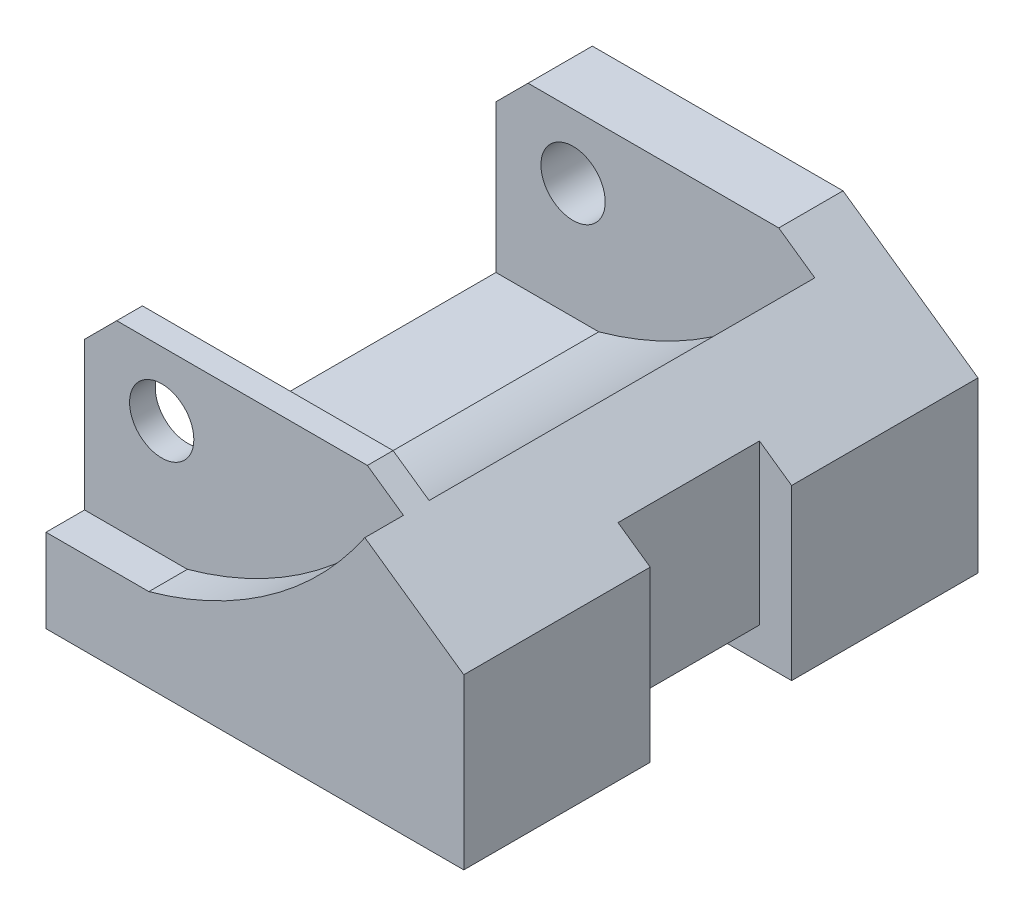
ISO-10303-21;
HEADER;
FILE_DESCRIPTION(('STEP AP214'),'2;1');
FILE_NAME('part.step','',(''),(''),'','','');
FILE_SCHEMA(('AUTOMOTIVE_DESIGN { 1 0 10303 214 1 1 1 1 }'));
ENDSEC;
DATA;
#1=APPLICATION_CONTEXT('core data for automotive mechanical design processes');
#2=APPLICATION_PROTOCOL_DEFINITION('international standard','automotive_design',2000,#1);
#3=PRODUCT_CONTEXT('',#1,'mechanical');
#4=PRODUCT('Part','Part','',(#3));
#5=PRODUCT_RELATED_PRODUCT_CATEGORY('part','',(#4));
#6=PRODUCT_DEFINITION_FORMATION('','',#4);
#7=PRODUCT_DEFINITION_CONTEXT('part definition',#1,'design');
#8=PRODUCT_DEFINITION('design','',#6,#7);
#9=PRODUCT_DEFINITION_SHAPE('','',#8);
#10=(LENGTH_UNIT() NAMED_UNIT(*) SI_UNIT(.MILLI.,.METRE.));
#11=(NAMED_UNIT(*) PLANE_ANGLE_UNIT() SI_UNIT($,.RADIAN.));
#12=(NAMED_UNIT(*) SI_UNIT($,.STERADIAN.) SOLID_ANGLE_UNIT());
#13=UNCERTAINTY_MEASURE_WITH_UNIT(LENGTH_MEASURE(1.E-05),#10,'distance_accuracy_value','');
#14=(GEOMETRIC_REPRESENTATION_CONTEXT(3) GLOBAL_UNCERTAINTY_ASSIGNED_CONTEXT((#13)) GLOBAL_UNIT_ASSIGNED_CONTEXT((#10,
#11,#12)) REPRESENTATION_CONTEXT('',''));
#15=CARTESIAN_POINT('',(0.,0.,0.));
#16=DIRECTION('',(0.,0.,1.));
#17=DIRECTION('',(1.,0.,0.));
#18=AXIS2_PLACEMENT_3D('',#15,#16,#17);
#19=CARTESIAN_POINT('',(65.,0.,40.));
#20=DIRECTION('',(-1.,0.,0.));
#21=DIRECTION('',(0.,0.,1.));
#22=AXIS2_PLACEMENT_3D('',#19,#20,#21);
#23=PLANE('',#22);
#24=DIRECTION('',(0.,0.,-1.));
#25=VECTOR('',#24,1.);
#26=CARTESIAN_POINT('',(65.,0.,40.));
#27=LINE('',#26,#25);
#28=CARTESIAN_POINT('',(65.,0.,40.));
#29=VERTEX_POINT('',#28);
#30=CARTESIAN_POINT('',(65.,0.,11.));
#31=VERTEX_POINT('',#30);
#32=EDGE_CURVE('E216',#29,#31,#27,.T.);
#33=ORIENTED_EDGE('',*,*,#32,.T.);
#34=DIRECTION('',(0.,-1.,0.));
#35=VECTOR('',#34,1.);
#36=CARTESIAN_POINT('',(65.,0.,11.));
#37=LINE('',#36,#35);
#38=CARTESIAN_POINT('',(65.,26.2956416975963,11.));
#39=VERTEX_POINT('',#38);
#40=EDGE_CURVE('E189',#39,#31,#37,.T.);
#41=ORIENTED_EDGE('',*,*,#40,.F.);
#42=DIRECTION('',(0.,0.,-1.));
#43=VECTOR('',#42,1.);
#44=CARTESIAN_POINT('',(65.,26.2956416975963,40.));
#45=LINE('',#44,#43);
#46=CARTESIAN_POINT('',(65.,26.2956416975963,40.));
#47=VERTEX_POINT('',#46);
#48=EDGE_CURVE('E360',#47,#39,#45,.T.);
#49=ORIENTED_EDGE('',*,*,#48,.F.);
#50=DIRECTION('',(0.,1.,0.));
#51=VECTOR('',#50,1.);
#52=CARTESIAN_POINT('',(65.,0.,40.));
#53=LINE('',#52,#51);
#54=EDGE_CURVE('E336',#29,#47,#53,.T.);
#55=ORIENTED_EDGE('',*,*,#54,.F.);
#56=EDGE_LOOP('',(#33,#41,#49,#55));
#57=FACE_BOUND('',#56,.T.);
#58=ADVANCED_FACE('F43',(#57),#23,.F.);
#59=CARTESIAN_POINT('',(0.,0.,40.));
#60=DIRECTION('',(0.,1.,0.));
#61=DIRECTION('',(0.,0.,1.));
#62=AXIS2_PLACEMENT_3D('',#59,#60,#61);
#63=PLANE('',#62);
#64=DIRECTION('',(1.,0.,0.));
#65=VECTOR('',#64,1.);
#66=CARTESIAN_POINT('',(0.,0.,-11.));
#67=LINE('',#66,#65);
#68=CARTESIAN_POINT('',(0.,0.,-11.));
#69=VERTEX_POINT('',#68);
#70=CARTESIAN_POINT('',(65.,0.,-11.));
#71=VERTEX_POINT('',#70);
#72=EDGE_CURVE('E191',#69,#71,#67,.T.);
#73=ORIENTED_EDGE('',*,*,#72,.F.);
#74=DIRECTION('',(0.,0.,-1.));
#75=VECTOR('',#74,1.);
#76=CARTESIAN_POINT('',(0.,0.,40.));
#77=LINE('',#76,#75);
#78=CARTESIAN_POINT('',(0.,0.,-40.));
#79=VERTEX_POINT('',#78);
#80=EDGE_CURVE('E215',#69,#79,#77,.T.);
#81=ORIENTED_EDGE('',*,*,#80,.T.);
#82=DIRECTION('',(1.,0.,0.));
#83=VECTOR('',#82,1.);
#84=CARTESIAN_POINT('',(0.,0.,-40.));
#85=LINE('',#84,#83);
#86=CARTESIAN_POINT('',(65.,0.,-40.));
#87=VERTEX_POINT('',#86);
#88=EDGE_CURVE('E344',#79,#87,#85,.T.);
#89=ORIENTED_EDGE('',*,*,#88,.T.);
#90=EDGE_CURVE('E358',#71,#87,#27,.T.);
#91=ORIENTED_EDGE('',*,*,#90,.F.);
#92=EDGE_LOOP('',(#73,#81,#89,#91));
#93=FACE_BOUND('',#92,.T.);
#94=ADVANCED_FACE('F435',(#93),#63,.F.);
#95=CARTESIAN_POINT('',(0.,41.,40.));
#96=DIRECTION('',(1.,0.,0.));
#97=DIRECTION('',(0.,1.,0.));
#98=AXIS2_PLACEMENT_3D('',#95,#96,#97);
#99=PLANE('',#98);
#100=DIRECTION('',(0.,-1.,0.));
#101=VECTOR('',#100,1.);
#102=CARTESIAN_POINT('',(0.,0.,-11.));
#103=LINE('',#102,#101);
#104=CARTESIAN_POINT('',(0.,5.,-11.));
#105=VERTEX_POINT('',#104);
#106=EDGE_CURVE('E206',#105,#69,#103,.T.);
#107=ORIENTED_EDGE('',*,*,#106,.F.);
#108=DIRECTION('',(0.,0.,-1.));
#109=VECTOR('',#108,1.);
#110=CARTESIAN_POINT('',(0.,5.,0.));
#111=LINE('',#110,#109);
#112=CARTESIAN_POINT('',(0.,5.,11.));
#113=VERTEX_POINT('',#112);
#114=EDGE_CURVE('E202',#113,#105,#111,.T.);
#115=ORIENTED_EDGE('',*,*,#114,.F.);
#116=DIRECTION('',(0.,-1.,0.));
#117=VECTOR('',#116,1.);
#118=CARTESIAN_POINT('',(0.,0.,11.));
#119=LINE('',#118,#117);
#120=CARTESIAN_POINT('',(0.,0.,11.));
#121=VERTEX_POINT('',#120);
#122=EDGE_CURVE('E56',#113,#121,#119,.T.);
#123=ORIENTED_EDGE('',*,*,#122,.T.);
#124=CARTESIAN_POINT('',(0.,0.,40.));
#125=VERTEX_POINT('',#124);
#126=EDGE_CURVE('E204',#125,#121,#77,.T.);
#127=ORIENTED_EDGE('',*,*,#126,.F.);
#128=DIRECTION('',(0.,-1.,0.));
#129=VECTOR('',#128,1.);
#130=CARTESIAN_POINT('',(0.,41.,40.));
#131=LINE('',#130,#129);
#132=CARTESIAN_POINT('',(0.,13.,40.));
#133=VERTEX_POINT('',#132);
#134=EDGE_CURVE('E335',#133,#125,#131,.T.);
#135=ORIENTED_EDGE('',*,*,#134,.F.);
#136=DIRECTION('',(0.,0.,1.));
#137=VECTOR('',#136,1.);
#138=CARTESIAN_POINT('',(0.,13.,34.));
#139=LINE('',#138,#137);
#140=CARTESIAN_POINT('',(0.,13.,34.));
#141=VERTEX_POINT('',#140);
#142=EDGE_CURVE('E272',#141,#133,#139,.T.);
#143=ORIENTED_EDGE('',*,*,#142,.F.);
#144=DIRECTION('',(0.,1.,0.));
#145=VECTOR('',#144,1.);
#146=CARTESIAN_POINT('',(0.,0.,34.));
#147=LINE('',#146,#145);
#148=CARTESIAN_POINT('',(0.,36.,34.));
#149=VERTEX_POINT('',#148);
#150=EDGE_CURVE('E262',#141,#149,#147,.T.);
#151=ORIENTED_EDGE('',*,*,#150,.T.);
#152=DIRECTION('',(0.,0.,-1.));
#153=VECTOR('',#152,1.);
#154=CARTESIAN_POINT('',(0.,36.,40.));
#155=LINE('',#154,#153);
#156=CARTESIAN_POINT('',(0.,36.,30.));
#157=VERTEX_POINT('',#156);
#158=EDGE_CURVE('E212',#149,#157,#155,.T.);
#159=ORIENTED_EDGE('',*,*,#158,.T.);
#160=DIRECTION('',(0.,-1.,0.));
#161=VECTOR('',#160,1.);
#162=CARTESIAN_POINT('',(0.,36.,30.));
#163=LINE('',#162,#161);
#164=CARTESIAN_POINT('',(0.,13.,30.));
#165=VERTEX_POINT('',#164);
#166=EDGE_CURVE('E290',#157,#165,#163,.T.);
#167=ORIENTED_EDGE('',*,*,#166,.T.);
#168=DIRECTION('',(0.,0.,1.));
#169=VECTOR('',#168,1.);
#170=CARTESIAN_POINT('',(0.,13.,-30.));
#171=LINE('',#170,#169);
#172=CARTESIAN_POINT('',(0.,13.,-30.));
#173=VERTEX_POINT('',#172);
#174=EDGE_CURVE('E308',#173,#165,#171,.T.);
#175=ORIENTED_EDGE('',*,*,#174,.F.);
#176=DIRECTION('',(0.,-1.,0.));
#177=VECTOR('',#176,1.);
#178=CARTESIAN_POINT('',(0.,36.,-30.));
#179=LINE('',#178,#177);
#180=CARTESIAN_POINT('',(0.,36.,-30.));
#181=VERTEX_POINT('',#180);
#182=EDGE_CURVE('E286',#181,#173,#179,.T.);
#183=ORIENTED_EDGE('',*,*,#182,.F.);
#184=CARTESIAN_POINT('',(0.,36.,-40.));
#185=VERTEX_POINT('',#184);
#186=EDGE_CURVE('E211',#181,#185,#155,.T.);
#187=ORIENTED_EDGE('',*,*,#186,.T.);
#188=DIRECTION('',(0.,-1.,0.));
#189=VECTOR('',#188,1.);
#190=CARTESIAN_POINT('',(0.,41.,-40.));
#191=LINE('',#190,#189);
#192=EDGE_CURVE('E332',#185,#79,#191,.T.);
#193=ORIENTED_EDGE('',*,*,#192,.T.);
#194=ORIENTED_EDGE('',*,*,#80,.F.);
#195=EDGE_LOOP('',(#107,#115,#123,#127,#135,#143,#151,#159,#167,#175,#183,#187,#193,#194));
#196=FACE_BOUND('',#195,.T.);
#197=ADVANCED_FACE('F205',(#196),#99,.F.);
#198=DIRECTION('',(0.,-1.,0.));
#199=VECTOR('',#198,1.);
#200=CARTESIAN_POINT('',(65.,0.,-11.));
#201=LINE('',#200,#199);
#202=CARTESIAN_POINT('',(65.,26.2956416975963,-11.));
#203=VERTEX_POINT('',#202);
#204=EDGE_CURVE('E233',#203,#71,#201,.T.);
#205=ORIENTED_EDGE('',*,*,#204,.T.);
#206=ORIENTED_EDGE('',*,*,#90,.T.);
#207=DIRECTION('',(0.,1.,0.));
#208=VECTOR('',#207,1.);
#209=CARTESIAN_POINT('',(65.,0.,-40.));
#210=LINE('',#209,#208);
#211=CARTESIAN_POINT('',(65.,26.2956416975963,-40.));
#212=VERTEX_POINT('',#211);
#213=EDGE_CURVE('E350',#87,#212,#210,.T.);
#214=ORIENTED_EDGE('',*,*,#213,.T.);
#215=EDGE_CURVE('E357',#203,#212,#45,.T.);
#216=ORIENTED_EDGE('',*,*,#215,.F.);
#217=EDGE_LOOP('',(#205,#206,#214,#216));
#218=FACE_BOUND('',#217,.T.);
#219=ADVANCED_FACE('F368',(#218),#23,.F.);
#220=CARTESIAN_POINT('',(0.,36.,40.));
#221=DIRECTION('',(0.707106781186546,-0.707106781186548,0.));
#222=DIRECTION('',(0.,0.,-1.));
#223=AXIS2_PLACEMENT_3D('',#220,#221,#222);
#224=PLANE('',#223);
#225=ORIENTED_EDGE('',*,*,#158,.F.);
#226=DIRECTION('',(0.707106781186549,0.707106781186547,0.));
#227=VECTOR('',#226,1.);
#228=CARTESIAN_POINT('',(-18.,18.,34.));
#229=LINE('',#228,#227);
#230=CARTESIAN_POINT('',(5.00000000000003,41.,34.));
#231=VERTEX_POINT('',#230);
#232=EDGE_CURVE('E270',#149,#231,#229,.T.);
#233=ORIENTED_EDGE('',*,*,#232,.T.);
#234=DIRECTION('',(0.,0.,1.));
#235=VECTOR('',#234,1.);
#236=CARTESIAN_POINT('',(5.00000000000003,41.,40.));
#237=LINE('',#236,#235);
#238=CARTESIAN_POINT('',(5.00000000000003,41.,30.));
#239=VERTEX_POINT('',#238);
#240=EDGE_CURVE('E225',#239,#231,#237,.T.);
#241=ORIENTED_EDGE('',*,*,#240,.F.);
#242=DIRECTION('',(-0.707106781186548,-0.707106781186546,0.));
#243=VECTOR('',#242,1.);
#244=CARTESIAN_POINT('',(5.00000000000003,41.,30.));
#245=LINE('',#244,#243);
#246=EDGE_CURVE('E294',#239,#157,#245,.T.);
#247=ORIENTED_EDGE('',*,*,#246,.T.);
#248=EDGE_LOOP('',(#225,#233,#241,#247));
#249=FACE_BOUND('',#248,.T.);
#250=ADVANCED_FACE('F403',(#249),#224,.F.);
#251=CARTESIAN_POINT('',(0.,0.,40.));
#252=DIRECTION('',(0.,0.,1.));
#253=DIRECTION('',(1.,0.,0.));
#254=AXIS2_PLACEMENT_3D('',#251,#252,#253);
#255=PLANE('',#254);
#256=CARTESIAN_POINT('',(0.,70.8273291792038,40.));
#257=DIRECTION('',(0.,0.,1.));
#258=DIRECTION('',(1.,0.,0.));
#259=AXIS2_PLACEMENT_3D('',#256,#257,#258);
#260=CIRCLE('',#259,60.);
#261=CARTESIAN_POINT('',(16.,13.,40.));
#262=VERTEX_POINT('',#261);
#263=CARTESIAN_POINT('',(49.6060034384075,37.0746341331975,40.));
#264=VERTEX_POINT('',#263);
#265=EDGE_CURVE('E255',#262,#264,#260,.T.);
#266=ORIENTED_EDGE('',*,*,#265,.F.);
#267=DIRECTION('',(-1.,0.,0.));
#268=VECTOR('',#267,1.);
#269=CARTESIAN_POINT('',(0.,13.,40.));
#270=LINE('',#269,#268);
#271=EDGE_CURVE('E259',#262,#133,#270,.T.);
#272=ORIENTED_EDGE('',*,*,#271,.T.);
#273=ORIENTED_EDGE('',*,*,#134,.T.);
#274=DIRECTION('',(1.,0.,0.));
#275=VECTOR('',#274,1.);
#276=CARTESIAN_POINT('',(0.,0.,40.));
#277=LINE('',#276,#275);
#278=EDGE_CURVE('E209',#125,#29,#277,.T.);
#279=ORIENTED_EDGE('',*,*,#278,.T.);
#280=ORIENTED_EDGE('',*,*,#54,.T.);
#281=DIRECTION('',(-0.819152044288995,0.573576436351041,0.));
#282=VECTOR('',#281,1.);
#283=CARTESIAN_POINT('',(65.,26.2956416975963,40.));
#284=LINE('',#283,#282);
#285=EDGE_CURVE('E337',#47,#264,#284,.T.);
#286=ORIENTED_EDGE('',*,*,#285,.T.);
#287=EDGE_LOOP('',(#266,#272,#273,#279,#280,#286));
#288=FACE_BOUND('',#287,.T.);
#289=ADVANCED_FACE('F418',(#288),#255,.T.);
#290=CARTESIAN_POINT('',(12.,31.,40.));
#291=DIRECTION('',(0.,0.,-1.));
#292=DIRECTION('',(-1.,0.,0.));
#293=AXIS2_PLACEMENT_3D('',#290,#291,#292);
#294=CYLINDRICAL_SURFACE('',#293,5.);
#295=CARTESIAN_POINT('',(12.,31.,30.));
#296=DIRECTION('',(0.,0.,1.));
#297=DIRECTION('',(1.,0.,0.));
#298=AXIS2_PLACEMENT_3D('',#295,#296,#297);
#299=CIRCLE('',#298,5.);
#300=CARTESIAN_POINT('',(17.,31.,30.));
#301=VERTEX_POINT('',#300);
#302=EDGE_CURVE('E282',#301,#301,#299,.T.);
#303=ORIENTED_EDGE('',*,*,#302,.F.);
#304=EDGE_LOOP('',(#303));
#305=FACE_BOUND('',#304,.T.);
#306=CARTESIAN_POINT('',(12.,31.,34.));
#307=DIRECTION('',(0.,0.,1.));
#308=DIRECTION('',(1.,0.,0.));
#309=AXIS2_PLACEMENT_3D('',#306,#307,#308);
#310=CIRCLE('',#309,5.);
#311=CARTESIAN_POINT('',(17.,31.,34.));
#312=VERTEX_POINT('',#311);
#313=EDGE_CURVE('E249',#312,#312,#310,.T.);
#314=ORIENTED_EDGE('',*,*,#313,.T.);
#315=EDGE_LOOP('',(#314));
#316=FACE_BOUND('',#315,.T.);
#317=ADVANCED_FACE('F465',(#305,#316),#294,.F.);
#318=CARTESIAN_POINT('',(44.,41.,40.));
#319=DIRECTION('',(0.,-1.,0.));
#320=DIRECTION('',(1.,0.,0.));
#321=AXIS2_PLACEMENT_3D('',#318,#319,#320);
#322=PLANE('',#321);
#323=DIRECTION('',(-1.,0.,0.));
#324=VECTOR('',#323,1.);
#325=CARTESIAN_POINT('',(44.,41.,-30.));
#326=LINE('',#325,#324);
#327=CARTESIAN_POINT('',(44.,41.,-30.));
#328=VERTEX_POINT('',#327);
#329=CARTESIAN_POINT('',(5.00000000000003,41.,-30.));
#330=VERTEX_POINT('',#329);
#331=EDGE_CURVE('E305',#328,#330,#326,.T.);
#332=ORIENTED_EDGE('',*,*,#331,.F.);
#333=DIRECTION('',(0.,0.,-1.));
#334=VECTOR('',#333,1.);
#335=CARTESIAN_POINT('',(44.,41.,40.));
#336=LINE('',#335,#334);
#337=CARTESIAN_POINT('',(44.,41.,-40.));
#338=VERTEX_POINT('',#337);
#339=EDGE_CURVE('E342',#328,#338,#336,.T.);
#340=ORIENTED_EDGE('',*,*,#339,.T.);
#341=DIRECTION('',(-1.,0.,0.));
#342=VECTOR('',#341,1.);
#343=CARTESIAN_POINT('',(44.,41.,-40.));
#344=LINE('',#343,#342);
#345=CARTESIAN_POINT('',(5.00000000000003,41.,-40.));
#346=VERTEX_POINT('',#345);
#347=EDGE_CURVE('E331',#338,#346,#344,.T.);
#348=ORIENTED_EDGE('',*,*,#347,.T.);
#349=EDGE_CURVE('E224',#346,#330,#237,.T.);
#350=ORIENTED_EDGE('',*,*,#349,.T.);
#351=EDGE_LOOP('',(#332,#340,#348,#350));
#352=FACE_BOUND('',#351,.T.);
#353=ADVANCED_FACE('F380',(#352),#322,.F.);
#354=CARTESIAN_POINT('',(12.,31.,-40.));
#355=DIRECTION('',(0.,0.,1.));
#356=DIRECTION('',(1.,0.,0.));
#357=AXIS2_PLACEMENT_3D('',#354,#355,#356);
#358=CIRCLE('',#357,5.);
#359=CARTESIAN_POINT('',(17.,31.,-40.));
#360=VERTEX_POINT('',#359);
#361=EDGE_CURVE('E324',#360,#360,#358,.T.);
#362=ORIENTED_EDGE('',*,*,#361,.F.);
#363=EDGE_LOOP('',(#362));
#364=FACE_BOUND('',#363,.T.);
#365=CARTESIAN_POINT('',(12.,31.,-30.));
#366=DIRECTION('',(0.,0.,1.));
#367=DIRECTION('',(1.,0.,0.));
#368=AXIS2_PLACEMENT_3D('',#365,#366,#367);
#369=CIRCLE('',#368,5.);
#370=CARTESIAN_POINT('',(17.,31.,-30.));
#371=VERTEX_POINT('',#370);
#372=EDGE_CURVE('E283',#371,#371,#369,.T.);
#373=ORIENTED_EDGE('',*,*,#372,.T.);
#374=EDGE_LOOP('',(#373));
#375=FACE_BOUND('',#374,.T.);
#376=ADVANCED_FACE('F454',(#364,#375),#294,.F.);
#377=CARTESIAN_POINT('',(0.,0.,-40.));
#378=DIRECTION('',(0.,0.,1.));
#379=DIRECTION('',(1.,0.,0.));
#380=AXIS2_PLACEMENT_3D('',#377,#378,#379);
#381=PLANE('',#380);
#382=ORIENTED_EDGE('',*,*,#192,.F.);
#383=DIRECTION('',(-0.707106781186549,-0.707106781186547,0.));
#384=VECTOR('',#383,1.);
#385=CARTESIAN_POINT('',(0.,36.,-40.));
#386=LINE('',#385,#384);
#387=EDGE_CURVE('E219',#185,#346,#386,.F.);
#388=ORIENTED_EDGE('',*,*,#387,.T.);
#389=ORIENTED_EDGE('',*,*,#347,.F.);
#390=DIRECTION('',(-0.819152044288995,0.573576436351041,0.));
#391=VECTOR('',#390,1.);
#392=CARTESIAN_POINT('',(65.,26.2956416975963,-40.));
#393=LINE('',#392,#391);
#394=EDGE_CURVE('E348',#212,#338,#393,.T.);
#395=ORIENTED_EDGE('',*,*,#394,.F.);
#396=ORIENTED_EDGE('',*,*,#213,.F.);
#397=ORIENTED_EDGE('',*,*,#88,.F.);
#398=EDGE_LOOP('',(#382,#388,#389,#395,#396,#397));
#399=FACE_BOUND('',#398,.T.);
#400=ORIENTED_EDGE('',*,*,#361,.T.);
#401=EDGE_LOOP('',(#400));
#402=FACE_BOUND('',#401,.T.);
#403=ADVANCED_FACE('F371',(#399,#402),#381,.F.);
#404=ORIENTED_EDGE('',*,*,#126,.T.);
#405=DIRECTION('',(1.,0.,0.));
#406=VECTOR('',#405,1.);
#407=CARTESIAN_POINT('',(0.,0.,11.));
#408=LINE('',#407,#406);
#409=EDGE_CURVE('E190',#121,#31,#408,.T.);
#410=ORIENTED_EDGE('',*,*,#409,.T.);
#411=ORIENTED_EDGE('',*,*,#32,.F.);
#412=ORIENTED_EDGE('',*,*,#278,.F.);
#413=EDGE_LOOP('',(#404,#410,#411,#412));
#414=FACE_BOUND('',#413,.T.);
#415=ADVANCED_FACE('F207',(#414),#63,.F.);
#416=CARTESIAN_POINT('',(65.,26.2956416975963,40.));
#417=DIRECTION('',(-0.573576436351041,-0.819152044288995,0.));
#418=DIRECTION('',(0.819152044288995,-0.573576436351041,0.));
#419=AXIS2_PLACEMENT_3D('',#416,#417,#418);
#420=PLANE('',#419);
#421=ORIENTED_EDGE('',*,*,#48,.T.);
#422=DIRECTION('',(-0.819152044288995,0.573576436351041,0.));
#423=VECTOR('',#422,1.);
#424=CARTESIAN_POINT('',(65.,26.2956416975963,11.));
#425=LINE('',#424,#423);
#426=CARTESIAN_POINT('',(60.,29.7966793886448,11.));
#427=VERTEX_POINT('',#426);
#428=EDGE_CURVE('E11',#39,#427,#425,.T.);
#429=ORIENTED_EDGE('',*,*,#428,.T.);
#430=DIRECTION('',(0.,0.,1.));
#431=VECTOR('',#430,1.);
#432=CARTESIAN_POINT('',(60.,29.7966793886448,40.));
#433=LINE('',#432,#431);
#434=CARTESIAN_POINT('',(60.,29.7966793886448,-11.));
#435=VERTEX_POINT('',#434);
#436=EDGE_CURVE('E226',#435,#427,#433,.T.);
#437=ORIENTED_EDGE('',*,*,#436,.F.);
#438=DIRECTION('',(-0.819152044288995,0.573576436351041,0.));
#439=VECTOR('',#438,1.);
#440=CARTESIAN_POINT('',(65.,26.2956416975963,-11.));
#441=LINE('',#440,#439);
#442=EDGE_CURVE('E55',#203,#435,#441,.T.);
#443=ORIENTED_EDGE('',*,*,#442,.F.);
#444=ORIENTED_EDGE('',*,*,#215,.T.);
#445=ORIENTED_EDGE('',*,*,#394,.T.);
#446=ORIENTED_EDGE('',*,*,#339,.F.);
#447=DIRECTION('',(-0.819152044288996,0.573576436351041,0.));
#448=VECTOR('',#447,1.);
#449=CARTESIAN_POINT('',(49.6060034384076,37.0746341331975,-30.));
#450=LINE('',#449,#448);
#451=CARTESIAN_POINT('',(49.6060034384075,37.0746341331975,-30.));
#452=VERTEX_POINT('',#451);
#453=EDGE_CURVE('E299',#452,#328,#450,.T.);
#454=ORIENTED_EDGE('',*,*,#453,.F.);
#455=DIRECTION('',(0.,0.,1.));
#456=VECTOR('',#455,1.);
#457=CARTESIAN_POINT('',(49.6060034384075,37.0746341331975,-30.));
#458=LINE('',#457,#456);
#459=CARTESIAN_POINT('',(49.6060034384076,37.0746341331975,30.));
#460=VERTEX_POINT('',#459);
#461=EDGE_CURVE('E325',#452,#460,#458,.T.);
#462=ORIENTED_EDGE('',*,*,#461,.T.);
#463=DIRECTION('',(-0.819152044288996,0.573576436351041,0.));
#464=VECTOR('',#463,1.);
#465=CARTESIAN_POINT('',(49.6060034384076,37.0746341331975,30.));
#466=LINE('',#465,#464);
#467=CARTESIAN_POINT('',(44.,41.,30.));
#468=VERTEX_POINT('',#467);
#469=EDGE_CURVE('E314',#460,#468,#466,.T.);
#470=ORIENTED_EDGE('',*,*,#469,.T.);
#471=CARTESIAN_POINT('',(44.,41.,34.));
#472=VERTEX_POINT('',#471);
#473=EDGE_CURVE('E354',#472,#468,#336,.T.);
#474=ORIENTED_EDGE('',*,*,#473,.F.);
#475=DIRECTION('',(0.819152044288996,-0.573576436351041,0.));
#476=VECTOR('',#475,1.);
#477=CARTESIAN_POINT('',(33.739255572946,48.1846505954664,34.));
#478=LINE('',#477,#476);
#479=CARTESIAN_POINT('',(49.6060034384075,37.0746341331975,34.));
#480=VERTEX_POINT('',#479);
#481=EDGE_CURVE('E254',#472,#480,#478,.T.);
#482=ORIENTED_EDGE('',*,*,#481,.T.);
#483=DIRECTION('',(0.,0.,1.));
#484=VECTOR('',#483,1.);
#485=CARTESIAN_POINT('',(49.6060034384075,37.0746341331975,34.));
#486=LINE('',#485,#484);
#487=EDGE_CURVE('E278',#480,#264,#486,.T.);
#488=ORIENTED_EDGE('',*,*,#487,.T.);
#489=ORIENTED_EDGE('',*,*,#285,.F.);
#490=EDGE_LOOP('',(#421,#429,#437,#443,#444,#445,#446,#454,#462,#470,#474,#482,#488,#489));
#491=FACE_BOUND('',#490,.T.);
#492=ADVANCED_FACE('F240',(#491),#420,.F.);
#493=ORIENTED_EDGE('',*,*,#240,.T.);
#494=DIRECTION('',(1.,0.,0.));
#495=VECTOR('',#494,1.);
#496=CARTESIAN_POINT('',(0.,41.,34.));
#497=LINE('',#496,#495);
#498=EDGE_CURVE('E269',#231,#472,#497,.T.);
#499=ORIENTED_EDGE('',*,*,#498,.T.);
#500=ORIENTED_EDGE('',*,*,#473,.T.);
#501=DIRECTION('',(-1.,0.,0.));
#502=VECTOR('',#501,1.);
#503=CARTESIAN_POINT('',(44.,41.,30.));
#504=LINE('',#503,#502);
#505=EDGE_CURVE('E320',#468,#239,#504,.T.);
#506=ORIENTED_EDGE('',*,*,#505,.T.);
#507=EDGE_LOOP('',(#493,#499,#500,#506));
#508=FACE_BOUND('',#507,.T.);
#509=ADVANCED_FACE('F402',(#508),#322,.F.);
#510=DIRECTION('',(-0.707106781186548,-0.707106781186546,0.));
#511=VECTOR('',#510,1.);
#512=CARTESIAN_POINT('',(5.00000000000003,41.,-30.));
#513=LINE('',#512,#511);
#514=EDGE_CURVE('E304',#330,#181,#513,.T.);
#515=ORIENTED_EDGE('',*,*,#514,.F.);
#516=ORIENTED_EDGE('',*,*,#349,.F.);
#517=ORIENTED_EDGE('',*,*,#387,.F.);
#518=ORIENTED_EDGE('',*,*,#186,.F.);
#519=EDGE_LOOP('',(#515,#516,#517,#518));
#520=FACE_BOUND('',#519,.T.);
#521=ADVANCED_FACE('F46',(#520),#224,.F.);
#522=CARTESIAN_POINT('',(0.,70.8273291792038,-30.));
#523=DIRECTION('',(0.,0.,1.));
#524=DIRECTION('',(1.,0.,0.));
#525=AXIS2_PLACEMENT_3D('',#522,#523,#524);
#526=CYLINDRICAL_SURFACE('',#525,60.);
#527=CARTESIAN_POINT('',(0.,70.8273291792038,30.));
#528=DIRECTION('',(0.,0.,1.));
#529=DIRECTION('',(1.,0.,0.));
#530=AXIS2_PLACEMENT_3D('',#527,#528,#529);
#531=CIRCLE('',#530,60.);
#532=CARTESIAN_POINT('',(16.,13.,30.));
#533=VERTEX_POINT('',#532);
#534=EDGE_CURVE('E315',#533,#460,#531,.T.);
#535=ORIENTED_EDGE('',*,*,#534,.T.);
#536=ORIENTED_EDGE('',*,*,#461,.F.);
#537=CARTESIAN_POINT('',(0.,70.8273291792038,-30.));
#538=DIRECTION('',(0.,0.,1.));
#539=DIRECTION('',(1.,0.,0.));
#540=AXIS2_PLACEMENT_3D('',#537,#538,#539);
#541=CIRCLE('',#540,60.);
#542=CARTESIAN_POINT('',(16.,13.,-30.));
#543=VERTEX_POINT('',#542);
#544=EDGE_CURVE('E300',#543,#452,#541,.T.);
#545=ORIENTED_EDGE('',*,*,#544,.F.);
#546=DIRECTION('',(0.,0.,1.));
#547=VECTOR('',#546,1.);
#548=CARTESIAN_POINT('',(16.,13.,-30.));
#549=LINE('',#548,#547);
#550=EDGE_CURVE('E326',#543,#533,#549,.T.);
#551=ORIENTED_EDGE('',*,*,#550,.T.);
#552=EDGE_LOOP('',(#535,#536,#545,#551));
#553=FACE_BOUND('',#552,.T.);
#554=ADVANCED_FACE('F394',(#553),#526,.F.);
#555=CARTESIAN_POINT('',(0.,13.,-30.));
#556=DIRECTION('',(0.,-1.,0.));
#557=DIRECTION('',(0.,0.,-1.));
#558=AXIS2_PLACEMENT_3D('',#555,#556,#557);
#559=PLANE('',#558);
#560=DIRECTION('',(1.,0.,0.));
#561=VECTOR('',#560,1.);
#562=CARTESIAN_POINT('',(0.,13.,30.));
#563=LINE('',#562,#561);
#564=EDGE_CURVE('E310',#165,#533,#563,.T.);
#565=ORIENTED_EDGE('',*,*,#564,.T.);
#566=ORIENTED_EDGE('',*,*,#550,.F.);
#567=DIRECTION('',(1.,0.,0.));
#568=VECTOR('',#567,1.);
#569=CARTESIAN_POINT('',(0.,13.,-30.));
#570=LINE('',#569,#568);
#571=EDGE_CURVE('E291',#173,#543,#570,.T.);
#572=ORIENTED_EDGE('',*,*,#571,.F.);
#573=ORIENTED_EDGE('',*,*,#174,.T.);
#574=EDGE_LOOP('',(#565,#566,#572,#573));
#575=FACE_BOUND('',#574,.T.);
#576=ADVANCED_FACE('F389',(#575),#559,.F.);
#577=CARTESIAN_POINT('',(0.,70.8273291792038,-30.));
#578=DIRECTION('',(0.,0.,1.));
#579=DIRECTION('',(1.,0.,0.));
#580=AXIS2_PLACEMENT_3D('',#577,#578,#579);
#581=PLANE('',#580);
#582=ORIENTED_EDGE('',*,*,#372,.F.);
#583=EDGE_LOOP('',(#582));
#584=FACE_BOUND('',#583,.T.);
#585=ORIENTED_EDGE('',*,*,#182,.T.);
#586=ORIENTED_EDGE('',*,*,#571,.T.);
#587=ORIENTED_EDGE('',*,*,#544,.T.);
#588=ORIENTED_EDGE('',*,*,#453,.T.);
#589=ORIENTED_EDGE('',*,*,#331,.T.);
#590=ORIENTED_EDGE('',*,*,#514,.T.);
#591=EDGE_LOOP('',(#585,#586,#587,#588,#589,#590));
#592=FACE_BOUND('',#591,.T.);
#593=ADVANCED_FACE('F382',(#584,#592),#581,.T.);
#594=CARTESIAN_POINT('',(0.,70.8273291792038,30.));
#595=DIRECTION('',(0.,0.,1.));
#596=DIRECTION('',(1.,0.,0.));
#597=AXIS2_PLACEMENT_3D('',#594,#595,#596);
#598=PLANE('',#597);
#599=ORIENTED_EDGE('',*,*,#302,.T.);
#600=EDGE_LOOP('',(#599));
#601=FACE_BOUND('',#600,.T.);
#602=ORIENTED_EDGE('',*,*,#166,.F.);
#603=ORIENTED_EDGE('',*,*,#246,.F.);
#604=ORIENTED_EDGE('',*,*,#505,.F.);
#605=ORIENTED_EDGE('',*,*,#469,.F.);
#606=ORIENTED_EDGE('',*,*,#534,.F.);
#607=ORIENTED_EDGE('',*,*,#564,.F.);
#608=EDGE_LOOP('',(#602,#603,#604,#605,#606,#607));
#609=FACE_BOUND('',#608,.T.);
#610=ADVANCED_FACE('F391',(#601,#609),#598,.F.);
#611=CARTESIAN_POINT('',(0.,70.8273291792038,34.));
#612=DIRECTION('',(0.,0.,1.));
#613=DIRECTION('',(1.,0.,0.));
#614=AXIS2_PLACEMENT_3D('',#611,#612,#613);
#615=CYLINDRICAL_SURFACE('',#614,60.);
#616=ORIENTED_EDGE('',*,*,#265,.T.);
#617=ORIENTED_EDGE('',*,*,#487,.F.);
#618=CARTESIAN_POINT('',(0.,70.8273291792038,34.));
#619=DIRECTION('',(0.,0.,1.));
#620=DIRECTION('',(1.,0.,0.));
#621=AXIS2_PLACEMENT_3D('',#618,#619,#620);
#622=CIRCLE('',#621,60.);
#623=CARTESIAN_POINT('',(16.,13.,34.));
#624=VERTEX_POINT('',#623);
#625=EDGE_CURVE('E256',#624,#480,#622,.T.);
#626=ORIENTED_EDGE('',*,*,#625,.F.);
#627=DIRECTION('',(0.,0.,1.));
#628=VECTOR('',#627,1.);
#629=CARTESIAN_POINT('',(16.,13.,34.));
#630=LINE('',#629,#628);
#631=EDGE_CURVE('E279',#624,#262,#630,.T.);
#632=ORIENTED_EDGE('',*,*,#631,.T.);
#633=EDGE_LOOP('',(#616,#617,#626,#632));
#634=FACE_BOUND('',#633,.T.);
#635=ADVANCED_FACE('F416',(#634),#615,.F.);
#636=CARTESIAN_POINT('',(0.,13.,34.));
#637=DIRECTION('',(0.,1.,0.));
#638=DIRECTION('',(0.,0.,1.));
#639=AXIS2_PLACEMENT_3D('',#636,#637,#638);
#640=PLANE('',#639);
#641=ORIENTED_EDGE('',*,*,#271,.F.);
#642=ORIENTED_EDGE('',*,*,#631,.F.);
#643=DIRECTION('',(-1.,0.,0.));
#644=VECTOR('',#643,1.);
#645=CARTESIAN_POINT('',(0.,13.,34.));
#646=LINE('',#645,#644);
#647=EDGE_CURVE('E265',#624,#141,#646,.T.);
#648=ORIENTED_EDGE('',*,*,#647,.T.);
#649=ORIENTED_EDGE('',*,*,#142,.T.);
#650=EDGE_LOOP('',(#641,#642,#648,#649));
#651=FACE_BOUND('',#650,.T.);
#652=ADVANCED_FACE('F413',(#651),#640,.T.);
#653=CARTESIAN_POINT('',(0.,70.8273291792038,34.));
#654=DIRECTION('',(0.,0.,1.));
#655=DIRECTION('',(1.,0.,0.));
#656=AXIS2_PLACEMENT_3D('',#653,#654,#655);
#657=PLANE('',#656);
#658=ORIENTED_EDGE('',*,*,#313,.F.);
#659=EDGE_LOOP('',(#658));
#660=FACE_BOUND('',#659,.T.);
#661=ORIENTED_EDGE('',*,*,#481,.F.);
#662=ORIENTED_EDGE('',*,*,#498,.F.);
#663=ORIENTED_EDGE('',*,*,#232,.F.);
#664=ORIENTED_EDGE('',*,*,#150,.F.);
#665=ORIENTED_EDGE('',*,*,#647,.F.);
#666=ORIENTED_EDGE('',*,*,#625,.T.);
#667=EDGE_LOOP('',(#661,#662,#663,#664,#665,#666));
#668=FACE_BOUND('',#667,.T.);
#669=ADVANCED_FACE('F407',(#660,#668),#657,.T.);
#670=CARTESIAN_POINT('',(60.,0.,11.));
#671=DIRECTION('',(0.,0.,1.));
#672=DIRECTION('',(1.,0.,0.));
#673=AXIS2_PLACEMENT_3D('',#670,#671,#672);
#674=PLANE('',#673);
#675=ORIENTED_EDGE('',*,*,#40,.T.);
#676=ORIENTED_EDGE('',*,*,#409,.F.);
#677=ORIENTED_EDGE('',*,*,#122,.F.);
#678=DIRECTION('',(1.,0.,0.));
#679=VECTOR('',#678,1.);
#680=CARTESIAN_POINT('',(0.,5.,11.));
#681=LINE('',#680,#679);
#682=CARTESIAN_POINT('',(60.,5.,11.));
#683=VERTEX_POINT('',#682);
#684=EDGE_CURVE('E198',#113,#683,#681,.T.);
#685=ORIENTED_EDGE('',*,*,#684,.T.);
#686=DIRECTION('',(0.,-1.,0.));
#687=VECTOR('',#686,1.);
#688=CARTESIAN_POINT('',(60.,0.,11.));
#689=LINE('',#688,#687);
#690=EDGE_CURVE('E241',#427,#683,#689,.T.);
#691=ORIENTED_EDGE('',*,*,#690,.F.);
#692=ORIENTED_EDGE('',*,*,#428,.F.);
#693=EDGE_LOOP('',(#675,#676,#677,#685,#691,#692));
#694=FACE_BOUND('',#693,.T.);
#695=ADVANCED_FACE('F187',(#694),#674,.F.);
#696=CARTESIAN_POINT('',(60.,0.,-11.));
#697=DIRECTION('',(0.,0.,1.));
#698=DIRECTION('',(0.,-1.,0.));
#699=AXIS2_PLACEMENT_3D('',#696,#697,#698);
#700=PLANE('',#699);
#701=ORIENTED_EDGE('',*,*,#442,.T.);
#702=DIRECTION('',(0.,-1.,0.));
#703=VECTOR('',#702,1.);
#704=CARTESIAN_POINT('',(60.,0.,-11.));
#705=LINE('',#704,#703);
#706=CARTESIAN_POINT('',(60.,5.,-11.));
#707=VERTEX_POINT('',#706);
#708=EDGE_CURVE('E70',#435,#707,#705,.T.);
#709=ORIENTED_EDGE('',*,*,#708,.T.);
#710=DIRECTION('',(1.,0.,0.));
#711=VECTOR('',#710,1.);
#712=CARTESIAN_POINT('',(0.,5.,-11.));
#713=LINE('',#712,#711);
#714=EDGE_CURVE('E246',#105,#707,#713,.T.);
#715=ORIENTED_EDGE('',*,*,#714,.F.);
#716=ORIENTED_EDGE('',*,*,#106,.T.);
#717=ORIENTED_EDGE('',*,*,#72,.T.);
#718=ORIENTED_EDGE('',*,*,#204,.F.);
#719=EDGE_LOOP('',(#701,#709,#715,#716,#717,#718));
#720=FACE_BOUND('',#719,.T.);
#721=ADVANCED_FACE('F229',(#720),#700,.T.);
#722=CARTESIAN_POINT('',(60.,0.,0.));
#723=DIRECTION('',(1.,0.,0.));
#724=DIRECTION('',(0.,0.,-1.));
#725=AXIS2_PLACEMENT_3D('',#722,#723,#724);
#726=PLANE('',#725);
#727=ORIENTED_EDGE('',*,*,#436,.T.);
#728=ORIENTED_EDGE('',*,*,#690,.T.);
#729=DIRECTION('',(0.,0.,-1.));
#730=VECTOR('',#729,1.);
#731=CARTESIAN_POINT('',(60.,5.,0.));
#732=LINE('',#731,#730);
#733=EDGE_CURVE('E245',#683,#707,#732,.T.);
#734=ORIENTED_EDGE('',*,*,#733,.T.);
#735=ORIENTED_EDGE('',*,*,#708,.F.);
#736=EDGE_LOOP('',(#727,#728,#734,#735));
#737=FACE_BOUND('',#736,.T.);
#738=ADVANCED_FACE('F238',(#737),#726,.T.);
#739=CARTESIAN_POINT('',(0.,5.,0.));
#740=DIRECTION('',(0.,-1.,0.));
#741=DIRECTION('',(0.,0.,-1.));
#742=AXIS2_PLACEMENT_3D('',#739,#740,#741);
#743=PLANE('',#742);
#744=ORIENTED_EDGE('',*,*,#684,.F.);
#745=ORIENTED_EDGE('',*,*,#114,.T.);
#746=ORIENTED_EDGE('',*,*,#714,.T.);
#747=ORIENTED_EDGE('',*,*,#733,.F.);
#748=EDGE_LOOP('',(#744,#745,#746,#747));
#749=FACE_BOUND('',#748,.T.);
#750=ADVANCED_FACE('F598',(#749),#743,.T.);
#751=CLOSED_SHELL('',(#58,#94,#197,#219,#250,#289,#317,#353,#376,#403,#415,#492,#509,#521,#554,
#576,#593,#610,#635,#652,#669,#695,#721,#738,#750));
#752=MANIFOLD_SOLID_BREP('B2',#751);
#753=ADVANCED_BREP_SHAPE_REPRESENTATION('',(#18,#752),#14);
#754=SHAPE_DEFINITION_REPRESENTATION(#9,#753);
ENDSEC;
END-ISO-10303-21;
